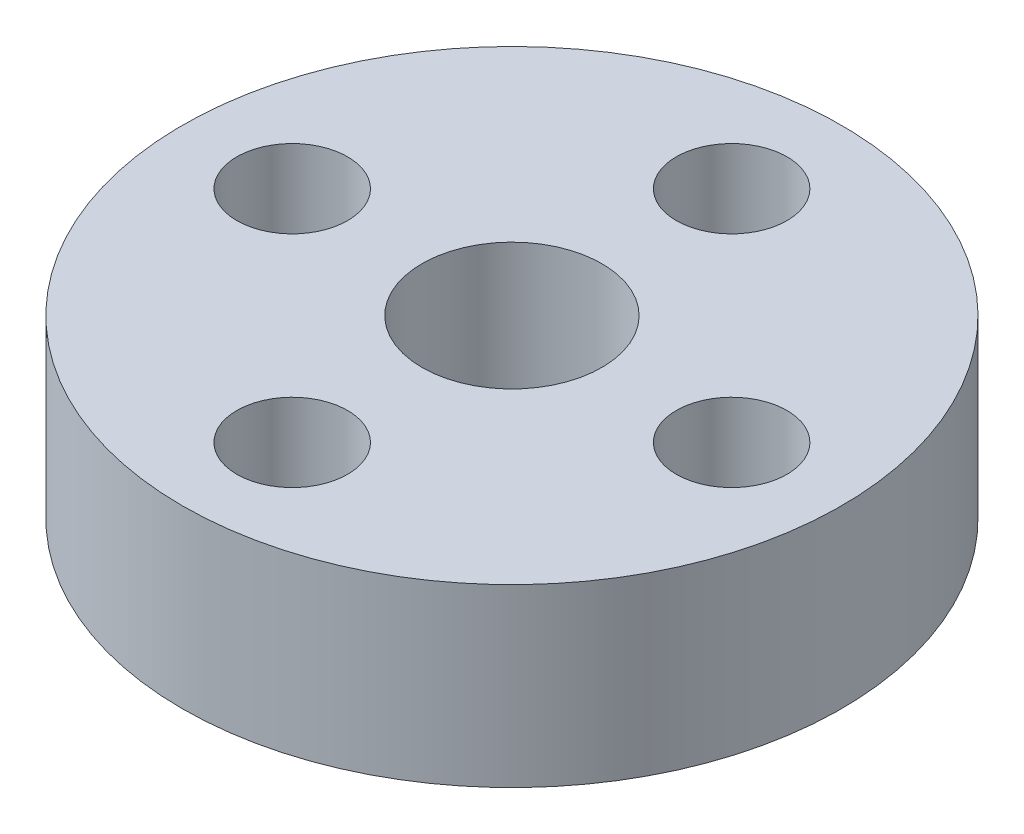
ISO-10303-21;
HEADER;
FILE_DESCRIPTION(('STEP AP214'),'2;1');
FILE_NAME('part.step','',(''),(''),'','','');
FILE_SCHEMA(('AUTOMOTIVE_DESIGN { 1 0 10303 214 1 1 1 1 }'));
ENDSEC;
DATA;
#1=APPLICATION_CONTEXT('core data for automotive mechanical design processes');
#2=APPLICATION_PROTOCOL_DEFINITION('international standard','automotive_design',2000,#1);
#3=PRODUCT_CONTEXT('',#1,'mechanical');
#4=PRODUCT('Part','Part','',(#3));
#5=PRODUCT_RELATED_PRODUCT_CATEGORY('part','',(#4));
#6=PRODUCT_DEFINITION_FORMATION('','',#4);
#7=PRODUCT_DEFINITION_CONTEXT('part definition',#1,'design');
#8=PRODUCT_DEFINITION('design','',#6,#7);
#9=PRODUCT_DEFINITION_SHAPE('','',#8);
#10=(LENGTH_UNIT() NAMED_UNIT(*) SI_UNIT(.MILLI.,.METRE.));
#11=(NAMED_UNIT(*) PLANE_ANGLE_UNIT() SI_UNIT($,.RADIAN.));
#12=(NAMED_UNIT(*) SI_UNIT($,.STERADIAN.) SOLID_ANGLE_UNIT());
#13=UNCERTAINTY_MEASURE_WITH_UNIT(LENGTH_MEASURE(1.E-05),#10,'distance_accuracy_value','');
#14=(GEOMETRIC_REPRESENTATION_CONTEXT(3) GLOBAL_UNCERTAINTY_ASSIGNED_CONTEXT((#13)) GLOBAL_UNIT_ASSIGNED_CONTEXT((#10,
#11,#12)) REPRESENTATION_CONTEXT('',''));
#15=CARTESIAN_POINT('',(0.,0.,0.));
#16=DIRECTION('',(0.,0.,1.));
#17=DIRECTION('',(1.,0.,0.));
#18=AXIS2_PLACEMENT_3D('',#15,#16,#17);
#19=CARTESIAN_POINT('',(0.,5.08,0.));
#20=DIRECTION('',(0.,1.,0.));
#21=DIRECTION('',(0.,0.,1.));
#22=AXIS2_PLACEMENT_3D('',#19,#20,#21);
#23=PLANE('',#22);
#24=CARTESIAN_POINT('',(3.59400408331214E-13,5.08,6.35));
#25=DIRECTION('',(0.,1.,0.));
#26=DIRECTION('',(0.,0.,1.));
#27=AXIS2_PLACEMENT_3D('',#24,#25,#26);
#28=CIRCLE('',#27,1.6);
#29=CARTESIAN_POINT('',(3.59400408331214E-13,5.08,7.95));
#30=VERTEX_POINT('',#29);
#31=EDGE_CURVE('E61',#30,#30,#28,.T.);
#32=ORIENTED_EDGE('',*,*,#31,.F.);
#33=EDGE_LOOP('',(#32));
#34=FACE_BOUND('',#33,.T.);
#35=CARTESIAN_POINT('',(6.35000000000018,5.08,-1.79700204165607E-13));
#36=DIRECTION('',(0.,1.,0.));
#37=DIRECTION('',(0.,0.,1.));
#38=AXIS2_PLACEMENT_3D('',#35,#36,#37);
#39=CIRCLE('',#38,1.6);
#40=CARTESIAN_POINT('',(6.35000000000018,5.08,1.59999999999982));
#41=VERTEX_POINT('',#40);
#42=EDGE_CURVE('E49',#41,#41,#39,.T.);
#43=ORIENTED_EDGE('',*,*,#42,.F.);
#44=EDGE_LOOP('',(#43));
#45=FACE_BOUND('',#44,.T.);
#46=CARTESIAN_POINT('',(0.,5.08,0.));
#47=DIRECTION('',(0.,1.,0.));
#48=DIRECTION('',(0.,0.,1.));
#49=AXIS2_PLACEMENT_3D('',#46,#47,#48);
#50=CIRCLE('',#49,9.525);
#51=CARTESIAN_POINT('',(0.,5.08,9.525));
#52=VERTEX_POINT('',#51);
#53=EDGE_CURVE('E10',#52,#52,#50,.T.);
#54=ORIENTED_EDGE('',*,*,#53,.T.);
#55=EDGE_LOOP('',(#54));
#56=FACE_BOUND('',#55,.T.);
#57=CARTESIAN_POINT('',(0.,5.08,-6.35));
#58=DIRECTION('',(0.,1.,0.));
#59=DIRECTION('',(0.,0.,1.));
#60=AXIS2_PLACEMENT_3D('',#57,#58,#59);
#61=CIRCLE('',#60,1.6);
#62=CARTESIAN_POINT('',(0.,5.08,-4.75));
#63=VERTEX_POINT('',#62);
#64=EDGE_CURVE('E44',#63,#63,#61,.T.);
#65=ORIENTED_EDGE('',*,*,#64,.F.);
#66=EDGE_LOOP('',(#65));
#67=FACE_BOUND('',#66,.T.);
#68=CARTESIAN_POINT('',(0.,5.08,0.));
#69=DIRECTION('',(0.,1.,0.));
#70=DIRECTION('',(0.,0.,1.));
#71=AXIS2_PLACEMENT_3D('',#68,#69,#70);
#72=CIRCLE('',#71,2.6);
#73=CARTESIAN_POINT('',(0.,5.08,2.6));
#74=VERTEX_POINT('',#73);
#75=EDGE_CURVE('E55',#74,#74,#72,.T.);
#76=ORIENTED_EDGE('',*,*,#75,.F.);
#77=EDGE_LOOP('',(#76));
#78=FACE_BOUND('',#77,.T.);
#79=CARTESIAN_POINT('',(-6.34999999999982,5.08,1.80477854883065E-13));
#80=DIRECTION('',(0.,1.,0.));
#81=DIRECTION('',(0.,0.,1.));
#82=AXIS2_PLACEMENT_3D('',#79,#80,#81);
#83=CIRCLE('',#82,1.6);
#84=CARTESIAN_POINT('',(-6.34999999999982,5.08,1.60000000000018));
#85=VERTEX_POINT('',#84);
#86=EDGE_CURVE('E67',#85,#85,#83,.T.);
#87=ORIENTED_EDGE('',*,*,#86,.F.);
#88=EDGE_LOOP('',(#87));
#89=FACE_BOUND('',#88,.T.);
#90=ADVANCED_FACE('F33',(#34,#45,#56,#67,#78,#89),#23,.T.);
#91=CARTESIAN_POINT('',(0.,0.,0.));
#92=DIRECTION('',(0.,1.,0.));
#93=DIRECTION('',(0.,0.,1.));
#94=AXIS2_PLACEMENT_3D('',#91,#92,#93);
#95=PLANE('',#94);
#96=CARTESIAN_POINT('',(0.,0.,0.));
#97=DIRECTION('',(0.,1.,0.));
#98=DIRECTION('',(0.,0.,1.));
#99=AXIS2_PLACEMENT_3D('',#96,#97,#98);
#100=CIRCLE('',#99,9.525);
#101=CARTESIAN_POINT('',(0.,0.,9.525));
#102=VERTEX_POINT('',#101);
#103=EDGE_CURVE('E37',#102,#102,#100,.T.);
#104=ORIENTED_EDGE('',*,*,#103,.F.);
#105=EDGE_LOOP('',(#104));
#106=FACE_BOUND('',#105,.T.);
#107=CARTESIAN_POINT('',(0.,0.,-6.35));
#108=DIRECTION('',(0.,1.,0.));
#109=DIRECTION('',(0.,0.,1.));
#110=AXIS2_PLACEMENT_3D('',#107,#108,#109);
#111=CIRCLE('',#110,1.6);
#112=CARTESIAN_POINT('',(0.,0.,-4.75));
#113=VERTEX_POINT('',#112);
#114=EDGE_CURVE('E46',#113,#113,#111,.T.);
#115=ORIENTED_EDGE('',*,*,#114,.T.);
#116=EDGE_LOOP('',(#115));
#117=FACE_BOUND('',#116,.T.);
#118=CARTESIAN_POINT('',(6.35000000000018,0.,-1.79700204165607E-13));
#119=DIRECTION('',(0.,1.,0.));
#120=DIRECTION('',(0.,0.,1.));
#121=AXIS2_PLACEMENT_3D('',#118,#119,#120);
#122=CIRCLE('',#121,1.6);
#123=CARTESIAN_POINT('',(6.35000000000018,0.,1.59999999999982));
#124=VERTEX_POINT('',#123);
#125=EDGE_CURVE('E52',#124,#124,#122,.T.);
#126=ORIENTED_EDGE('',*,*,#125,.T.);
#127=EDGE_LOOP('',(#126));
#128=FACE_BOUND('',#127,.T.);
#129=CARTESIAN_POINT('',(0.,0.,0.));
#130=DIRECTION('',(0.,1.,0.));
#131=DIRECTION('',(0.,0.,1.));
#132=AXIS2_PLACEMENT_3D('',#129,#130,#131);
#133=CIRCLE('',#132,2.6);
#134=CARTESIAN_POINT('',(0.,0.,2.6));
#135=VERTEX_POINT('',#134);
#136=EDGE_CURVE('E58',#135,#135,#133,.T.);
#137=ORIENTED_EDGE('',*,*,#136,.T.);
#138=EDGE_LOOP('',(#137));
#139=FACE_BOUND('',#138,.T.);
#140=CARTESIAN_POINT('',(3.59400408331214E-13,0.,6.35));
#141=DIRECTION('',(0.,1.,0.));
#142=DIRECTION('',(0.,0.,1.));
#143=AXIS2_PLACEMENT_3D('',#140,#141,#142);
#144=CIRCLE('',#143,1.6);
#145=CARTESIAN_POINT('',(3.59400408331214E-13,0.,7.95));
#146=VERTEX_POINT('',#145);
#147=EDGE_CURVE('E64',#146,#146,#144,.T.);
#148=ORIENTED_EDGE('',*,*,#147,.T.);
#149=EDGE_LOOP('',(#148));
#150=FACE_BOUND('',#149,.T.);
#151=CARTESIAN_POINT('',(-6.34999999999982,0.,1.80477854883065E-13));
#152=DIRECTION('',(0.,1.,0.));
#153=DIRECTION('',(0.,0.,1.));
#154=AXIS2_PLACEMENT_3D('',#151,#152,#153);
#155=CIRCLE('',#154,1.6);
#156=CARTESIAN_POINT('',(-6.34999999999982,0.,1.60000000000018));
#157=VERTEX_POINT('',#156);
#158=EDGE_CURVE('E70',#157,#157,#155,.T.);
#159=ORIENTED_EDGE('',*,*,#158,.T.);
#160=EDGE_LOOP('',(#159));
#161=FACE_BOUND('',#160,.T.);
#162=ADVANCED_FACE('F80',(#106,#117,#128,#139,#150,#161),#95,.F.);
#163=CARTESIAN_POINT('',(0.,5.08,0.));
#164=DIRECTION('',(0.,-1.,0.));
#165=DIRECTION('',(0.,0.,-1.));
#166=AXIS2_PLACEMENT_3D('',#163,#164,#165);
#167=CYLINDRICAL_SURFACE('',#166,9.525);
#168=ORIENTED_EDGE('',*,*,#53,.F.);
#169=EDGE_LOOP('',(#168));
#170=FACE_BOUND('',#169,.T.);
#171=ORIENTED_EDGE('',*,*,#103,.T.);
#172=EDGE_LOOP('',(#171));
#173=FACE_BOUND('',#172,.T.);
#174=ADVANCED_FACE('F35',(#170,#173),#167,.T.);
#175=CARTESIAN_POINT('',(0.,5.08,-6.35));
#176=DIRECTION('',(0.,-1.,0.));
#177=DIRECTION('',(0.,0.,-1.));
#178=AXIS2_PLACEMENT_3D('',#175,#176,#177);
#179=CYLINDRICAL_SURFACE('',#178,1.6);
#180=ORIENTED_EDGE('',*,*,#64,.T.);
#181=EDGE_LOOP('',(#180));
#182=FACE_BOUND('',#181,.T.);
#183=ORIENTED_EDGE('',*,*,#114,.F.);
#184=EDGE_LOOP('',(#183));
#185=FACE_BOUND('',#184,.T.);
#186=ADVANCED_FACE('F90',(#182,#185),#179,.F.);
#187=CARTESIAN_POINT('',(6.35000000000018,5.08,-1.79700204165607E-13));
#188=DIRECTION('',(0.,-1.,0.));
#189=DIRECTION('',(0.,0.,-1.));
#190=AXIS2_PLACEMENT_3D('',#187,#188,#189);
#191=CYLINDRICAL_SURFACE('',#190,1.6);
#192=ORIENTED_EDGE('',*,*,#42,.T.);
#193=EDGE_LOOP('',(#192));
#194=FACE_BOUND('',#193,.T.);
#195=ORIENTED_EDGE('',*,*,#125,.F.);
#196=EDGE_LOOP('',(#195));
#197=FACE_BOUND('',#196,.T.);
#198=ADVANCED_FACE('F93',(#194,#197),#191,.F.);
#199=CARTESIAN_POINT('',(0.,5.08,0.));
#200=DIRECTION('',(0.,-1.,0.));
#201=DIRECTION('',(0.,0.,-1.));
#202=AXIS2_PLACEMENT_3D('',#199,#200,#201);
#203=CYLINDRICAL_SURFACE('',#202,2.6);
#204=ORIENTED_EDGE('',*,*,#75,.T.);
#205=EDGE_LOOP('',(#204));
#206=FACE_BOUND('',#205,.T.);
#207=ORIENTED_EDGE('',*,*,#136,.F.);
#208=EDGE_LOOP('',(#207));
#209=FACE_BOUND('',#208,.T.);
#210=ADVANCED_FACE('F97',(#206,#209),#203,.F.);
#211=CARTESIAN_POINT('',(3.59400408331214E-13,5.08,6.35));
#212=DIRECTION('',(0.,-1.,0.));
#213=DIRECTION('',(0.,0.,-1.));
#214=AXIS2_PLACEMENT_3D('',#211,#212,#213);
#215=CYLINDRICAL_SURFACE('',#214,1.6);
#216=ORIENTED_EDGE('',*,*,#31,.T.);
#217=EDGE_LOOP('',(#216));
#218=FACE_BOUND('',#217,.T.);
#219=ORIENTED_EDGE('',*,*,#147,.F.);
#220=EDGE_LOOP('',(#219));
#221=FACE_BOUND('',#220,.T.);
#222=ADVANCED_FACE('F101',(#218,#221),#215,.F.);
#223=CARTESIAN_POINT('',(-6.34999999999982,5.08,1.80477854883065E-13));
#224=DIRECTION('',(0.,-1.,0.));
#225=DIRECTION('',(0.,0.,-1.));
#226=AXIS2_PLACEMENT_3D('',#223,#224,#225);
#227=CYLINDRICAL_SURFACE('',#226,1.6);
#228=ORIENTED_EDGE('',*,*,#86,.T.);
#229=EDGE_LOOP('',(#228));
#230=FACE_BOUND('',#229,.T.);
#231=ORIENTED_EDGE('',*,*,#158,.F.);
#232=EDGE_LOOP('',(#231));
#233=FACE_BOUND('',#232,.T.);
#234=ADVANCED_FACE('F76',(#230,#233),#227,.F.);
#235=CLOSED_SHELL('',(#90,#162,#174,#186,#198,#210,#222,#234));
#236=MANIFOLD_SOLID_BREP('B2',#235);
#237=ADVANCED_BREP_SHAPE_REPRESENTATION('',(#18,#236),#14);
#238=SHAPE_DEFINITION_REPRESENTATION(#9,#237);
ENDSEC;
END-ISO-10303-21;
